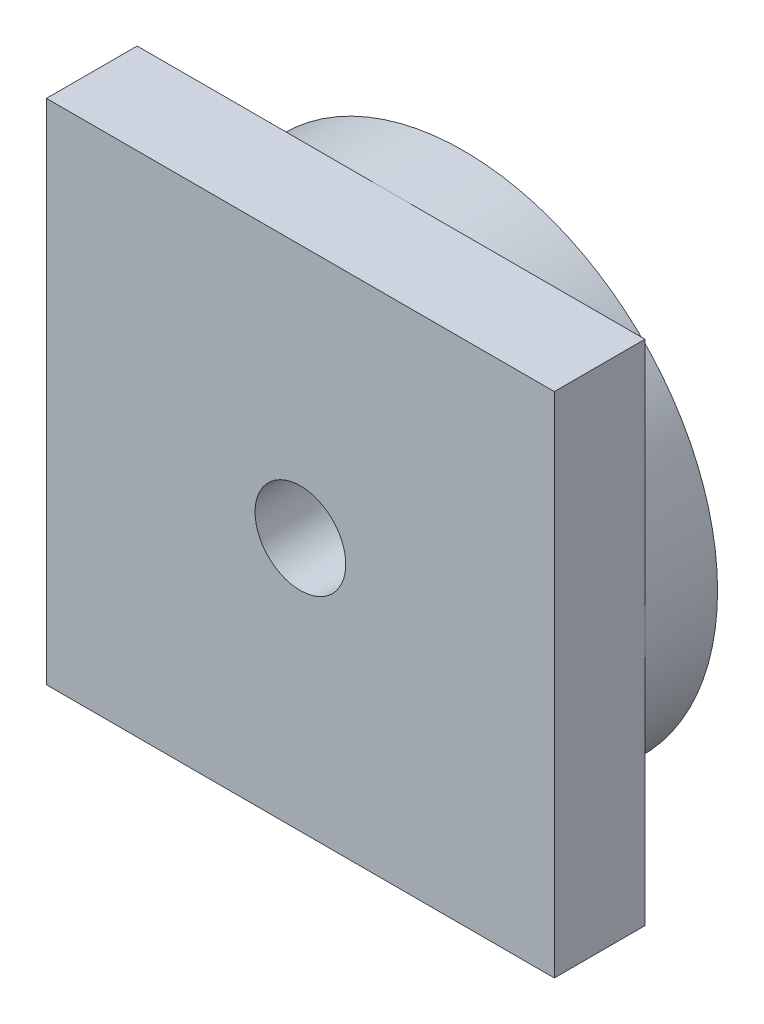
ISO-10303-21;
HEADER;
FILE_DESCRIPTION(('STEP AP214'),'2;1');
FILE_NAME('part.step','',(''),(''),'','','');
FILE_SCHEMA(('AUTOMOTIVE_DESIGN { 1 0 10303 214 1 1 1 1 }'));
ENDSEC;
DATA;
#1=APPLICATION_CONTEXT('core data for automotive mechanical design processes');
#2=APPLICATION_PROTOCOL_DEFINITION('international standard','automotive_design',2000,#1);
#3=PRODUCT_CONTEXT('',#1,'mechanical');
#4=PRODUCT('Part','Part','',(#3));
#5=PRODUCT_RELATED_PRODUCT_CATEGORY('part','',(#4));
#6=PRODUCT_DEFINITION_FORMATION('','',#4);
#7=PRODUCT_DEFINITION_CONTEXT('part definition',#1,'design');
#8=PRODUCT_DEFINITION('design','',#6,#7);
#9=PRODUCT_DEFINITION_SHAPE('','',#8);
#10=(LENGTH_UNIT() NAMED_UNIT(*) SI_UNIT(.MILLI.,.METRE.));
#11=(NAMED_UNIT(*) PLANE_ANGLE_UNIT() SI_UNIT($,.RADIAN.));
#12=(NAMED_UNIT(*) SI_UNIT($,.STERADIAN.) SOLID_ANGLE_UNIT());
#13=UNCERTAINTY_MEASURE_WITH_UNIT(LENGTH_MEASURE(1.E-05),#10,'distance_accuracy_value','');
#14=(GEOMETRIC_REPRESENTATION_CONTEXT(3) GLOBAL_UNCERTAINTY_ASSIGNED_CONTEXT((#13)) GLOBAL_UNIT_ASSIGNED_CONTEXT((#10,
#11,#12)) REPRESENTATION_CONTEXT('',''));
#15=CARTESIAN_POINT('',(0.,0.,0.));
#16=DIRECTION('',(0.,0.,1.));
#17=DIRECTION('',(1.,0.,0.));
#18=AXIS2_PLACEMENT_3D('',#15,#16,#17);
#19=CARTESIAN_POINT('',(0.,0.,22.));
#20=DIRECTION('',(0.,0.,-1.));
#21=DIRECTION('',(-1.,0.,0.));
#22=AXIS2_PLACEMENT_3D('',#19,#20,#21);
#23=PLANE('',#22);
#24=CARTESIAN_POINT('',(0.,0.,22.));
#25=DIRECTION('',(0.,0.,-1.));
#26=DIRECTION('',(-1.,0.,0.));
#27=AXIS2_PLACEMENT_3D('',#24,#25,#26);
#28=CIRCLE('',#27,5.);
#29=CARTESIAN_POINT('',(-5.,0.,22.));
#30=VERTEX_POINT('',#29);
#31=EDGE_CURVE('E123',#30,#30,#28,.T.);
#32=ORIENTED_EDGE('',*,*,#31,.F.);
#33=EDGE_LOOP('',(#32));
#34=FACE_BOUND('',#33,.T.);
#35=CARTESIAN_POINT('',(0.,0.,22.));
#36=DIRECTION('',(0.,0.,-1.));
#37=DIRECTION('',(-1.,0.,0.));
#38=AXIS2_PLACEMENT_3D('',#35,#36,#37);
#39=CIRCLE('',#38,11.);
#40=CARTESIAN_POINT('',(-11.,0.,22.));
#41=VERTEX_POINT('',#40);
#42=EDGE_CURVE('E11',#41,#41,#39,.F.);
#43=ORIENTED_EDGE('',*,*,#42,.F.);
#44=EDGE_LOOP('',(#43));
#45=FACE_BOUND('',#44,.T.);
#46=ADVANCED_FACE('F35',(#34,#45),#23,.T.);
#47=CARTESIAN_POINT('',(0.,0.,22.));
#48=DIRECTION('',(0.,0.,-1.));
#49=DIRECTION('',(-1.,0.,0.));
#50=AXIS2_PLACEMENT_3D('',#47,#48,#49);
#51=CYLINDRICAL_SURFACE('',#50,28.);
#52=CARTESIAN_POINT('',(0.,0.,14.));
#53=DIRECTION('',(0.,0.,1.));
#54=DIRECTION('',(1.,0.,0.));
#55=AXIS2_PLACEMENT_3D('',#52,#53,#54);
#56=CIRCLE('',#55,28.);
#57=CARTESIAN_POINT('',(28.,0.,14.));
#58=VERTEX_POINT('',#57);
#59=EDGE_CURVE('E122',#58,#58,#56,.T.);
#60=ORIENTED_EDGE('',*,*,#59,.T.);
#61=EDGE_LOOP('',(#60));
#62=FACE_BOUND('',#61,.T.);
#63=CARTESIAN_POINT('',(0.,0.,22.));
#64=DIRECTION('',(0.,0.,1.));
#65=DIRECTION('',(1.,0.,0.));
#66=AXIS2_PLACEMENT_3D('',#63,#64,#65);
#67=CIRCLE('',#66,28.);
#68=CARTESIAN_POINT('',(28.,0.,22.));
#69=VERTEX_POINT('',#68);
#70=CARTESIAN_POINT('',(0.,28.,22.));
#71=VERTEX_POINT('',#70);
#72=EDGE_CURVE('E43',#69,#71,#67,.T.);
#73=ORIENTED_EDGE('',*,*,#72,.F.);
#74=CARTESIAN_POINT('',(0.,-28.,22.));
#75=VERTEX_POINT('',#74);
#76=EDGE_CURVE('E50',#75,#69,#67,.T.);
#77=ORIENTED_EDGE('',*,*,#76,.F.);
#78=CARTESIAN_POINT('',(-28.,0.,22.));
#79=VERTEX_POINT('',#78);
#80=EDGE_CURVE('E54',#79,#75,#67,.T.);
#81=ORIENTED_EDGE('',*,*,#80,.F.);
#82=EDGE_CURVE('E119',#71,#79,#67,.T.);
#83=ORIENTED_EDGE('',*,*,#82,.F.);
#84=EDGE_LOOP('',(#73,#77,#81,#83));
#85=FACE_BOUND('',#84,.T.);
#86=ADVANCED_FACE('F37',(#62,#85),#51,.T.);
#87=DIRECTION('',(0.,1.,0.));
#88=VECTOR('',#87,1.);
#89=CARTESIAN_POINT('',(28.,-28.,22.));
#90=LINE('',#89,#88);
#91=CARTESIAN_POINT('',(28.,28.,22.));
#92=VERTEX_POINT('',#91);
#93=EDGE_CURVE('E111',#69,#92,#90,.T.);
#94=ORIENTED_EDGE('',*,*,#93,.F.);
#95=ORIENTED_EDGE('',*,*,#72,.T.);
#96=DIRECTION('',(-1.,0.,0.));
#97=VECTOR('',#96,1.);
#98=CARTESIAN_POINT('',(-28.,28.,22.));
#99=LINE('',#98,#97);
#100=EDGE_CURVE('E142',#92,#71,#99,.T.);
#101=ORIENTED_EDGE('',*,*,#100,.F.);
#102=EDGE_LOOP('',(#94,#95,#101));
#103=FACE_BOUND('',#102,.T.);
#104=ADVANCED_FACE('F165',(#103),#23,.T.);
#105=CARTESIAN_POINT('',(-28.,28.,22.));
#106=VERTEX_POINT('',#105);
#107=EDGE_CURVE('E141',#71,#106,#99,.T.);
#108=ORIENTED_EDGE('',*,*,#107,.F.);
#109=ORIENTED_EDGE('',*,*,#82,.T.);
#110=DIRECTION('',(0.,-1.,0.));
#111=VECTOR('',#110,1.);
#112=CARTESIAN_POINT('',(-28.,-28.,22.));
#113=LINE('',#112,#111);
#114=EDGE_CURVE('E145',#106,#79,#113,.T.);
#115=ORIENTED_EDGE('',*,*,#114,.F.);
#116=EDGE_LOOP('',(#108,#109,#115));
#117=FACE_BOUND('',#116,.T.);
#118=ADVANCED_FACE('F170',(#117),#23,.T.);
#119=CARTESIAN_POINT('',(-28.,-28.,22.));
#120=VERTEX_POINT('',#119);
#121=EDGE_CURVE('E144',#79,#120,#113,.T.);
#122=ORIENTED_EDGE('',*,*,#121,.F.);
#123=ORIENTED_EDGE('',*,*,#80,.T.);
#124=DIRECTION('',(1.,0.,0.));
#125=VECTOR('',#124,1.);
#126=CARTESIAN_POINT('',(-28.,-28.,22.));
#127=LINE('',#126,#125);
#128=EDGE_CURVE('E106',#120,#75,#127,.T.);
#129=ORIENTED_EDGE('',*,*,#128,.F.);
#130=EDGE_LOOP('',(#122,#123,#129));
#131=FACE_BOUND('',#130,.T.);
#132=ADVANCED_FACE('F159',(#131),#23,.T.);
#133=CARTESIAN_POINT('',(28.,-28.,32.));
#134=DIRECTION('',(-1.,0.,0.));
#135=DIRECTION('',(0.,0.,1.));
#136=AXIS2_PLACEMENT_3D('',#133,#134,#135);
#137=PLANE('',#136);
#138=CARTESIAN_POINT('',(28.,-28.,22.));
#139=VERTEX_POINT('',#138);
#140=EDGE_CURVE('E139',#139,#69,#90,.T.);
#141=ORIENTED_EDGE('',*,*,#140,.T.);
#142=ORIENTED_EDGE('',*,*,#93,.T.);
#143=DIRECTION('',(0.,0.,-1.));
#144=VECTOR('',#143,1.);
#145=CARTESIAN_POINT('',(28.,28.,32.));
#146=LINE('',#145,#144);
#147=CARTESIAN_POINT('',(28.,28.,32.));
#148=VERTEX_POINT('',#147);
#149=EDGE_CURVE('E91',#148,#92,#146,.T.);
#150=ORIENTED_EDGE('',*,*,#149,.F.);
#151=DIRECTION('',(0.,1.,0.));
#152=VECTOR('',#151,1.);
#153=CARTESIAN_POINT('',(28.,-28.,32.));
#154=LINE('',#153,#152);
#155=CARTESIAN_POINT('',(28.,-28.,32.));
#156=VERTEX_POINT('',#155);
#157=EDGE_CURVE('E97',#156,#148,#154,.T.);
#158=ORIENTED_EDGE('',*,*,#157,.F.);
#159=DIRECTION('',(0.,0.,-1.));
#160=VECTOR('',#159,1.);
#161=CARTESIAN_POINT('',(28.,-28.,32.));
#162=LINE('',#161,#160);
#163=EDGE_CURVE('E138',#156,#139,#162,.T.);
#164=ORIENTED_EDGE('',*,*,#163,.T.);
#165=EDGE_LOOP('',(#141,#142,#150,#158,#164));
#166=FACE_BOUND('',#165,.T.);
#167=ADVANCED_FACE('F109',(#166),#137,.F.);
#168=CARTESIAN_POINT('',(-28.,28.,32.));
#169=DIRECTION('',(0.,-1.,0.));
#170=DIRECTION('',(0.,0.,-1.));
#171=AXIS2_PLACEMENT_3D('',#168,#169,#170);
#172=PLANE('',#171);
#173=ORIENTED_EDGE('',*,*,#100,.T.);
#174=ORIENTED_EDGE('',*,*,#107,.T.);
#175=DIRECTION('',(0.,0.,-1.));
#176=VECTOR('',#175,1.);
#177=CARTESIAN_POINT('',(-28.,28.,32.));
#178=LINE('',#177,#176);
#179=CARTESIAN_POINT('',(-28.,28.,32.));
#180=VERTEX_POINT('',#179);
#181=EDGE_CURVE('E93',#180,#106,#178,.T.);
#182=ORIENTED_EDGE('',*,*,#181,.F.);
#183=DIRECTION('',(-1.,0.,0.));
#184=VECTOR('',#183,1.);
#185=CARTESIAN_POINT('',(-28.,28.,32.));
#186=LINE('',#185,#184);
#187=EDGE_CURVE('E86',#148,#180,#186,.T.);
#188=ORIENTED_EDGE('',*,*,#187,.F.);
#189=ORIENTED_EDGE('',*,*,#149,.T.);
#190=EDGE_LOOP('',(#173,#174,#182,#188,#189));
#191=FACE_BOUND('',#190,.T.);
#192=ADVANCED_FACE('F89',(#191),#172,.F.);
#193=CARTESIAN_POINT('',(-28.,-28.,32.));
#194=DIRECTION('',(1.,0.,0.));
#195=DIRECTION('',(0.,0.,-1.));
#196=AXIS2_PLACEMENT_3D('',#193,#194,#195);
#197=PLANE('',#196);
#198=ORIENTED_EDGE('',*,*,#114,.T.);
#199=ORIENTED_EDGE('',*,*,#121,.T.);
#200=DIRECTION('',(0.,0.,-1.));
#201=VECTOR('',#200,1.);
#202=CARTESIAN_POINT('',(-28.,-28.,32.));
#203=LINE('',#202,#201);
#204=CARTESIAN_POINT('',(-28.,-28.,32.));
#205=VERTEX_POINT('',#204);
#206=EDGE_CURVE('E115',#205,#120,#203,.T.);
#207=ORIENTED_EDGE('',*,*,#206,.F.);
#208=DIRECTION('',(0.,-1.,0.));
#209=VECTOR('',#208,1.);
#210=CARTESIAN_POINT('',(-28.,-28.,32.));
#211=LINE('',#210,#209);
#212=EDGE_CURVE('E96',#180,#205,#211,.T.);
#213=ORIENTED_EDGE('',*,*,#212,.F.);
#214=ORIENTED_EDGE('',*,*,#181,.T.);
#215=EDGE_LOOP('',(#198,#199,#207,#213,#214));
#216=FACE_BOUND('',#215,.T.);
#217=ADVANCED_FACE('F169',(#216),#197,.F.);
#218=CARTESIAN_POINT('',(-28.,-28.,32.));
#219=DIRECTION('',(0.,1.,0.));
#220=DIRECTION('',(0.,0.,1.));
#221=AXIS2_PLACEMENT_3D('',#218,#219,#220);
#222=PLANE('',#221);
#223=ORIENTED_EDGE('',*,*,#128,.T.);
#224=EDGE_CURVE('E148',#75,#139,#127,.T.);
#225=ORIENTED_EDGE('',*,*,#224,.T.);
#226=ORIENTED_EDGE('',*,*,#163,.F.);
#227=DIRECTION('',(1.,0.,0.));
#228=VECTOR('',#227,1.);
#229=CARTESIAN_POINT('',(-28.,-28.,32.));
#230=LINE('',#229,#228);
#231=EDGE_CURVE('E102',#205,#156,#230,.T.);
#232=ORIENTED_EDGE('',*,*,#231,.F.);
#233=ORIENTED_EDGE('',*,*,#206,.T.);
#234=EDGE_LOOP('',(#223,#225,#226,#232,#233));
#235=FACE_BOUND('',#234,.T.);
#236=ADVANCED_FACE('F155',(#235),#222,.F.);
#237=CARTESIAN_POINT('',(0.,0.,32.));
#238=DIRECTION('',(0.,0.,-1.));
#239=DIRECTION('',(-1.,0.,0.));
#240=AXIS2_PLACEMENT_3D('',#237,#238,#239);
#241=PLANE('',#240);
#242=CARTESIAN_POINT('',(0.,0.,32.));
#243=DIRECTION('',(0.,0.,-1.));
#244=DIRECTION('',(-1.,0.,0.));
#245=AXIS2_PLACEMENT_3D('',#242,#243,#244);
#246=CIRCLE('',#245,5.);
#247=CARTESIAN_POINT('',(-5.,0.,32.));
#248=VERTEX_POINT('',#247);
#249=EDGE_CURVE('E120',#248,#248,#246,.T.);
#250=ORIENTED_EDGE('',*,*,#249,.T.);
#251=EDGE_LOOP('',(#250));
#252=FACE_BOUND('',#251,.T.);
#253=ORIENTED_EDGE('',*,*,#157,.T.);
#254=ORIENTED_EDGE('',*,*,#187,.T.);
#255=ORIENTED_EDGE('',*,*,#212,.T.);
#256=ORIENTED_EDGE('',*,*,#231,.T.);
#257=EDGE_LOOP('',(#253,#254,#255,#256));
#258=FACE_BOUND('',#257,.T.);
#259=ADVANCED_FACE('F100',(#252,#258),#241,.F.);
#260=ORIENTED_EDGE('',*,*,#224,.F.);
#261=ORIENTED_EDGE('',*,*,#76,.T.);
#262=ORIENTED_EDGE('',*,*,#140,.F.);
#263=EDGE_LOOP('',(#260,#261,#262));
#264=FACE_BOUND('',#263,.T.);
#265=ADVANCED_FACE('F163',(#264),#23,.T.);
#266=CARTESIAN_POINT('',(0.,0.,14.));
#267=DIRECTION('',(0.,0.,1.));
#268=DIRECTION('',(1.,0.,0.));
#269=AXIS2_PLACEMENT_3D('',#266,#267,#268);
#270=PLANE('',#269);
#271=ORIENTED_EDGE('',*,*,#59,.F.);
#272=EDGE_LOOP('',(#271));
#273=FACE_BOUND('',#272,.T.);
#274=CARTESIAN_POINT('',(0.,0.,14.));
#275=DIRECTION('',(0.,0.,-1.));
#276=DIRECTION('',(-1.,0.,0.));
#277=AXIS2_PLACEMENT_3D('',#274,#275,#276);
#278=CIRCLE('',#277,11.);
#279=CARTESIAN_POINT('',(-11.,0.,14.));
#280=VERTEX_POINT('',#279);
#281=EDGE_CURVE('E129',#280,#280,#278,.T.);
#282=ORIENTED_EDGE('',*,*,#281,.F.);
#283=EDGE_LOOP('',(#282));
#284=FACE_BOUND('',#283,.T.);
#285=ADVANCED_FACE('F181',(#273,#284),#270,.F.);
#286=CARTESIAN_POINT('',(0.,0.,36.));
#287=DIRECTION('',(0.,0.,-1.));
#288=DIRECTION('',(-1.,0.,0.));
#289=AXIS2_PLACEMENT_3D('',#286,#287,#288);
#290=CYLINDRICAL_SURFACE('',#289,5.);
#291=ORIENTED_EDGE('',*,*,#31,.T.);
#292=EDGE_LOOP('',(#291));
#293=FACE_BOUND('',#292,.T.);
#294=ORIENTED_EDGE('',*,*,#249,.F.);
#295=EDGE_LOOP('',(#294));
#296=FACE_BOUND('',#295,.T.);
#297=ADVANCED_FACE('F184',(#293,#296),#290,.F.);
#298=CARTESIAN_POINT('',(0.,0.,14.));
#299=DIRECTION('',(0.,0.,1.));
#300=DIRECTION('',(1.,0.,0.));
#301=AXIS2_PLACEMENT_3D('',#298,#299,#300);
#302=CYLINDRICAL_SURFACE('',#301,11.);
#303=ORIENTED_EDGE('',*,*,#281,.T.);
#304=EDGE_LOOP('',(#303));
#305=FACE_BOUND('',#304,.T.);
#306=ORIENTED_EDGE('',*,*,#42,.T.);
#307=EDGE_LOOP('',(#306));
#308=FACE_BOUND('',#307,.T.);
#309=ADVANCED_FACE('F188',(#305,#308),#302,.F.);
#310=CLOSED_SHELL('',(#46,#86,#104,#118,#132,#167,#192,#217,#236,#259,#265,#285,#297,#309));
#311=MANIFOLD_SOLID_BREP('B2',#310);
#312=ADVANCED_BREP_SHAPE_REPRESENTATION('',(#18,#311),#14);
#313=SHAPE_DEFINITION_REPRESENTATION(#9,#312);
ENDSEC;
END-ISO-10303-21;
